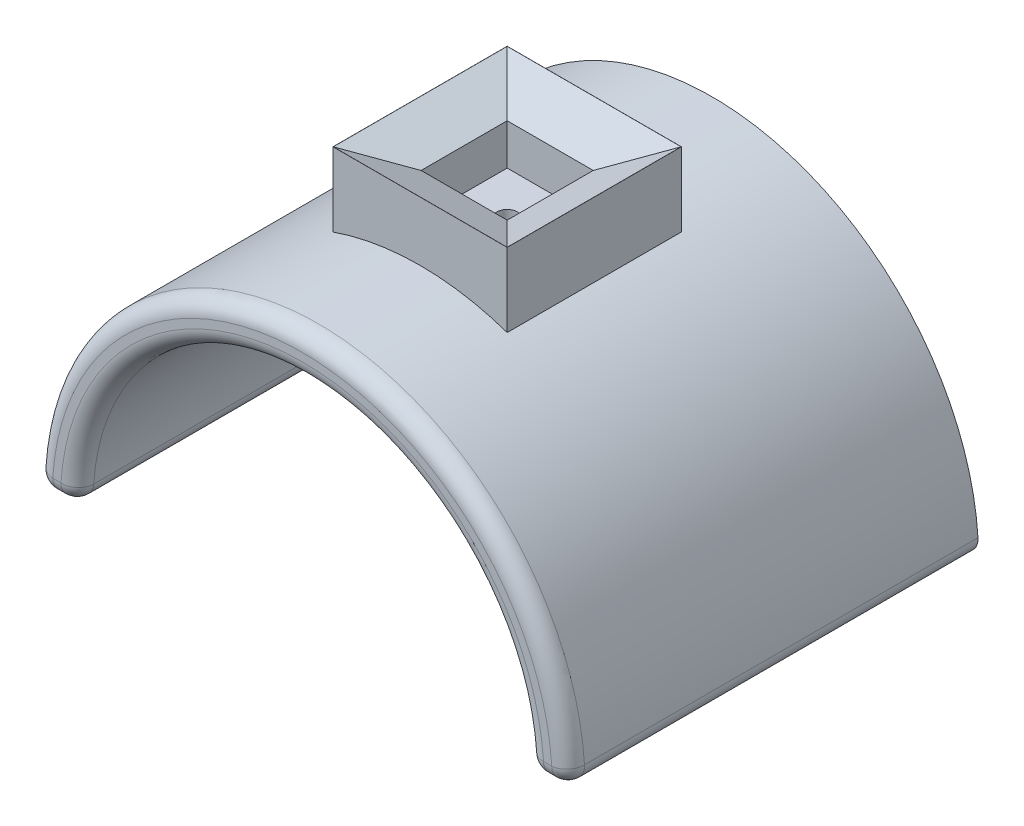
ISO-10303-21;
HEADER;
FILE_DESCRIPTION(('STEP AP214'),'2;1');
FILE_NAME('part.step','',(''),(''),'','','');
FILE_SCHEMA(('AUTOMOTIVE_DESIGN { 1 0 10303 214 1 1 1 1 }'));
ENDSEC;
DATA;
#1=APPLICATION_CONTEXT('core data for automotive mechanical design processes');
#2=APPLICATION_PROTOCOL_DEFINITION('international standard','automotive_design',2000,#1);
#3=PRODUCT_CONTEXT('',#1,'mechanical');
#4=PRODUCT('Part','Part','',(#3));
#5=PRODUCT_RELATED_PRODUCT_CATEGORY('part','',(#4));
#6=PRODUCT_DEFINITION_FORMATION('','',#4);
#7=PRODUCT_DEFINITION_CONTEXT('part definition',#1,'design');
#8=PRODUCT_DEFINITION('design','',#6,#7);
#9=PRODUCT_DEFINITION_SHAPE('','',#8);
#10=(LENGTH_UNIT() NAMED_UNIT(*) SI_UNIT(.MILLI.,.METRE.));
#11=(NAMED_UNIT(*) PLANE_ANGLE_UNIT() SI_UNIT($,.RADIAN.));
#12=(NAMED_UNIT(*) SI_UNIT($,.STERADIAN.) SOLID_ANGLE_UNIT());
#13=UNCERTAINTY_MEASURE_WITH_UNIT(LENGTH_MEASURE(1.E-05),#10,'distance_accuracy_value','');
#14=(GEOMETRIC_REPRESENTATION_CONTEXT(3) GLOBAL_UNCERTAINTY_ASSIGNED_CONTEXT((#13)) GLOBAL_UNIT_ASSIGNED_CONTEXT((#10,
#11,#12)) REPRESENTATION_CONTEXT('',''));
#15=CARTESIAN_POINT('',(0.,0.,0.));
#16=DIRECTION('',(0.,0.,1.));
#17=DIRECTION('',(1.,0.,0.));
#18=AXIS2_PLACEMENT_3D('',#15,#16,#17);
#19=CARTESIAN_POINT('',(0.,0.,50.));
#20=DIRECTION('',(0.,0.,-1.));
#21=DIRECTION('',(-1.,0.,0.));
#22=AXIS2_PLACEMENT_3D('',#19,#20,#21);
#23=CYLINDRICAL_SURFACE('',#22,65.);
#24=DIRECTION('',(0.,0.,-1.));
#25=VECTOR('',#24,1.);
#26=CARTESIAN_POINT('',(-64.8601020707973,4.26229508196721,50.));
#27=LINE('',#26,#25);
#28=CARTESIAN_POINT('',(-64.8601020707972,4.26229508196721,-50.));
#29=VERTEX_POINT('',#28);
#30=CARTESIAN_POINT('',(-64.8601020707973,4.26229508196721,46.));
#31=VERTEX_POINT('',#30);
#32=EDGE_CURVE('E292',#29,#31,#27,.F.);
#33=ORIENTED_EDGE('',*,*,#32,.T.);
#34=CARTESIAN_POINT('',(0.,0.,46.));
#35=DIRECTION('',(0.,0.,-1.));
#36=DIRECTION('',(-1.,0.,0.));
#37=AXIS2_PLACEMENT_3D('',#34,#35,#36);
#38=CIRCLE('',#37,65.);
#39=CARTESIAN_POINT('',(64.8601020707973,4.26229508196721,46.));
#40=VERTEX_POINT('',#39);
#41=EDGE_CURVE('E367',#31,#40,#38,.T.);
#42=ORIENTED_EDGE('',*,*,#41,.T.);
#43=DIRECTION('',(0.,0.,-1.));
#44=VECTOR('',#43,1.);
#45=CARTESIAN_POINT('',(64.8601020707973,4.26229508196721,50.));
#46=LINE('',#45,#44);
#47=CARTESIAN_POINT('',(64.8601020707972,4.26229508196721,-50.));
#48=VERTEX_POINT('',#47);
#49=EDGE_CURVE('E296',#40,#48,#46,.T.);
#50=ORIENTED_EDGE('',*,*,#49,.T.);
#51=CARTESIAN_POINT('',(0.,0.,-50.));
#52=DIRECTION('',(0.,0.,1.));
#53=DIRECTION('',(-1.,0.,0.));
#54=AXIS2_PLACEMENT_3D('',#51,#52,#53);
#55=CIRCLE('',#54,65.);
#56=EDGE_CURVE('E284',#48,#29,#55,.T.);
#57=ORIENTED_EDGE('',*,*,#56,.T.);
#58=EDGE_LOOP('',(#33,#42,#50,#57));
#59=FACE_BOUND('',#58,.T.);
#60=CARTESIAN_POINT('',(0.,0.,21.25));
#61=DIRECTION('',(0.,0.,-1.));
#62=DIRECTION('',(-1.,0.,0.));
#63=AXIS2_PLACEMENT_3D('',#60,#61,#62);
#64=CIRCLE('',#63,65.);
#65=CARTESIAN_POINT('',(-21.25,61.4283118765281,21.25));
#66=VERTEX_POINT('',#65);
#67=CARTESIAN_POINT('',(21.25,61.4283118765281,21.25));
#68=VERTEX_POINT('',#67);
#69=EDGE_CURVE('E234',#66,#68,#64,.T.);
#70=ORIENTED_EDGE('',*,*,#69,.F.);
#71=DIRECTION('',(0.,0.,-1.));
#72=VECTOR('',#71,1.);
#73=CARTESIAN_POINT('',(-21.25,61.4283118765281,21.25));
#74=LINE('',#73,#72);
#75=CARTESIAN_POINT('',(-21.25,61.4283118765281,-21.25));
#76=VERTEX_POINT('',#75);
#77=EDGE_CURVE('E248',#66,#76,#74,.T.);
#78=ORIENTED_EDGE('',*,*,#77,.T.);
#79=CARTESIAN_POINT('',(0.,0.,-21.25));
#80=DIRECTION('',(0.,0.,-1.));
#81=DIRECTION('',(-1.,0.,0.));
#82=AXIS2_PLACEMENT_3D('',#79,#80,#81);
#83=CIRCLE('',#82,65.);
#84=CARTESIAN_POINT('',(21.25,61.4283118765281,-21.25));
#85=VERTEX_POINT('',#84);
#86=EDGE_CURVE('E249',#76,#85,#83,.T.);
#87=ORIENTED_EDGE('',*,*,#86,.T.);
#88=DIRECTION('',(0.,0.,-1.));
#89=VECTOR('',#88,1.);
#90=CARTESIAN_POINT('',(21.25,61.4283118765281,21.25));
#91=LINE('',#90,#89);
#92=EDGE_CURVE('E273',#68,#85,#91,.T.);
#93=ORIENTED_EDGE('',*,*,#92,.F.);
#94=EDGE_LOOP('',(#70,#78,#87,#93));
#95=FACE_BOUND('',#94,.T.);
#96=ADVANCED_FACE('F43',(#59,#95),#23,.T.);
#97=CARTESIAN_POINT('',(0.,0.,50.));
#98=DIRECTION('',(0.,0.,-1.));
#99=DIRECTION('',(-1.,0.,0.));
#100=AXIS2_PLACEMENT_3D('',#97,#98,#99);
#101=CYLINDRICAL_SURFACE('',#100,55.);
#102=CARTESIAN_POINT('',(0.,55.,5.));
#103=CARTESIAN_POINT('',(0.140165542643633,55.0000003250651,5.00000131042897));
#104=CARTESIAN_POINT('',(0.280310836375489,54.999463099121,4.9941038271243));
#105=CARTESIAN_POINT('',(0.559647735606449,54.9973298977333,4.97055721053996));
#106=CARTESIAN_POINT('',(0.698839100152653,54.9957336640807,4.95290521125163));
#107=CARTESIAN_POINT('',(0.975341601463336,54.9915252299401,4.9059547124536));
#108=CARTESIAN_POINT('',(1.11265111440405,54.9889122029881,4.87664673837453));
#109=CARTESIAN_POINT('',(1.3843509275886,54.9827431487663,4.80658520165259));
#110=CARTESIAN_POINT('',(1.51874014035062,54.9791867765037,4.76582745136656));
#111=CARTESIAN_POINT('',(1.78346671336769,54.9712358234423,4.67321010086376));
#112=CARTESIAN_POINT('',(1.9138078149832,54.966842045131,4.62136112361292));
#113=CARTESIAN_POINT('',(2.16970034403316,54.9573361920492,4.50688959149565));
#114=CARTESIAN_POINT('',(2.29524998715764,54.9522238529467,4.44426307005639));
#115=CARTESIAN_POINT('',(2.54055449137373,54.9414292624663,4.30873613318204));
#116=CARTESIAN_POINT('',(2.66031267230901,54.9357473434701,4.23584169969684));
#117=CARTESIAN_POINT('',(2.89331660255279,54.9239686669126,4.08023922103316));
#118=CARTESIAN_POINT('',(3.00655992432694,54.9178717565432,3.99752755252106));
#119=CARTESIAN_POINT('',(3.22594593766439,54.9054220875069,3.82269436145111));
#120=CARTESIAN_POINT('',(3.33207170905746,54.8990687729506,3.73055164601981));
#121=CARTESIAN_POINT('',(3.53622867415894,54.8862965989905,3.53762899624862));
#122=CARTESIAN_POINT('',(3.63425686184818,54.8798777162311,3.436845882425));
#123=CARTESIAN_POINT('',(3.82145430421694,54.8671603808995,3.22741484254297));
#124=CARTESIAN_POINT('',(3.9106264137154,54.8608618900505,3.11876947058893));
#125=CARTESIAN_POINT('',(4.07954925530378,54.8485592768787,2.89430734424768));
#126=CARTESIAN_POINT('',(4.15929649841075,54.8425552640466,2.77848795814984));
#127=CARTESIAN_POINT('',(4.30886839958656,54.8310066516679,2.54036373131747));
#128=CARTESIAN_POINT('',(4.37867921983633,54.8254626972069,2.41805016561051));
#129=CARTESIAN_POINT('',(4.50777115735908,54.814999722907,2.16790662648178));
#130=CARTESIAN_POINT('',(4.56704836702819,54.810080935175,2.0400746276793));
#131=CARTESIAN_POINT('',(4.67459322681395,54.8010136708957,1.77988095614516));
#132=CARTESIAN_POINT('',(4.72286511732212,54.7968648977737,1.64752105071721));
#133=CARTESIAN_POINT('',(4.8080924478695,54.7894519847283,1.37916821584362));
#134=CARTESIAN_POINT('',(4.84504371811375,54.7861881708181,1.24317396774234));
#135=CARTESIAN_POINT('',(4.93824925740078,54.7778952217938,0.832050574861149));
#136=CARTESIAN_POINT('',(4.97727448398394,54.7743280156328,0.552763443679249));
#137=CARTESIAN_POINT('',(5.00789063424749,54.771536706463,-0.00826591696936007));
#138=CARTESIAN_POINT('',(4.99948260198416,54.77231250786,-0.290008092261656));
#139=CARTESIAN_POINT('',(4.93563943706431,54.7781021429205,-0.84724784072274));
#140=CARTESIAN_POINT('',(4.88034497648212,54.7831032992048,-1.12276156508057));
#141=CARTESIAN_POINT('',(4.72450073355428,54.7967622738177,-1.66057076988583));
#142=CARTESIAN_POINT('',(4.6239504357559,54.8054201337953,-1.9228660997412));
#143=CARTESIAN_POINT('',(4.38029660701809,54.8254310669799,-2.42725290454355));
#144=CARTESIAN_POINT('',(4.23713025025616,54.8367881143891,-2.66931386984633));
#145=CARTESIAN_POINT('',(3.91235231311207,54.8609143866888,-3.12602338950642));
#146=CARTESIAN_POINT('',(3.73073980416126,54.8736836456842,-3.34067128157013));
#147=CARTESIAN_POINT('',(3.33343740990056,54.8992519993287,-3.73728049178712));
#148=CARTESIAN_POINT('',(3.11762593205527,54.9120510334746,-3.91912003158649));
#149=CARTESIAN_POINT('',(2.65847495376653,54.9361927330635,-4.24400795692451));
#150=CARTESIAN_POINT('',(2.41513542999329,54.9475353972722,-4.38705630958761));
#151=CARTESIAN_POINT('',(1.90775448571964,54.9674891569605,-4.63029489668827));
#152=CARTESIAN_POINT('',(1.64371030164817,54.9760998870163,-4.73047939827757));
#153=CARTESIAN_POINT('',(1.10245309601858,54.9896156183442,-4.88505941104234));
#154=CARTESIAN_POINT('',(0.8252403999605,54.9945207111618,-4.9394560533832));
#155=CARTESIAN_POINT('',(0.266570370758789,55.0000607478585,-5.00076276880477));
#156=CARTESIAN_POINT('',(-0.0148683678511205,55.0007108110995,-5.00784097999307));
#157=CARTESIAN_POINT('',(-0.574928318900229,54.9977079951205,-4.97475086122375));
#158=CARTESIAN_POINT('',(-0.853549562664414,54.9940551637933,-4.93458305713244));
#159=CARTESIAN_POINT('',(-1.39958353399541,54.9828669212842,-4.80828056015822));
#160=CARTESIAN_POINT('',(-1.66701451462541,54.9753381224876,-4.72222414414945));
#161=CARTESIAN_POINT('',(-2.18364282990389,54.9572432082279,-4.50666733940147));
#162=CARTESIAN_POINT('',(-2.43283982355361,54.9466770359802,-4.37716613844234));
#163=CARTESIAN_POINT('',(-2.906689432048,54.923653027346,-4.07797596211013));
#164=CARTESIAN_POINT('',(-3.13127171037137,54.9111900012644,-3.90817599578766));
#165=CARTESIAN_POINT('',(-3.54880586005287,54.8857888447069,-3.53336710045009));
#166=CARTESIAN_POINT('',(-3.74175707672025,54.8728507044039,-3.32835744285458));
#167=CARTESIAN_POINT('',(-4.09113210873866,54.847912361713,-2.88822101458617));
#168=CARTESIAN_POINT('',(-4.24744593107302,54.8359150538645,-2.65300675433383));
#169=CARTESIAN_POINT('',(-4.51835252825773,54.814259489813,-2.15955777727335));
#170=CARTESIAN_POINT('',(-4.63294578696503,54.8046012064835,-1.9013233274866));
#171=CARTESIAN_POINT('',(-4.81697777138454,54.7887331922585,-1.36960081853375));
#172=CARTESIAN_POINT('',(-4.88648300709819,54.7825183838275,-1.09613587614866));
#173=CARTESIAN_POINT('',(-4.9785621767354,54.7742289376389,-0.541204505878983));
#174=CARTESIAN_POINT('',(-5.00113720319747,54.7721542035002,-0.259738264419823));
#175=CARTESIAN_POINT('',(-4.99936463768319,54.7723126212943,0.161511133205772));
#176=CARTESIAN_POINT('',(-4.99286580188123,54.7729076517531,0.301589450518621));
#177=CARTESIAN_POINT('',(-4.96813781859985,54.7751567165922,0.580684259170787));
#178=CARTESIAN_POINT('',(-4.94991302094352,54.7768103582725,0.719701124920744));
#179=CARTESIAN_POINT('',(-4.90185151455798,54.781132008528,0.995739211465156));
#180=CARTESIAN_POINT('',(-4.87201054055007,54.7838003896915,1.13275968001938));
#181=CARTESIAN_POINT('',(-4.80094912124343,54.7900735556209,1.40374409219709));
#182=CARTESIAN_POINT('',(-4.75973284428426,54.7936779973506,1.53770913601284));
#183=CARTESIAN_POINT('',(-4.66619991802295,54.801722415072,1.8017206899522));
#184=CARTESIAN_POINT('',(-4.61388024777648,54.8061626184154,1.93176612263266));
#185=CARTESIAN_POINT('',(-4.49854367268287,54.8157500190577,2.18693880690784));
#186=CARTESIAN_POINT('',(-4.43553068422733,54.8208969573861,2.31206783852861));
#187=CARTESIAN_POINT('',(-4.29921861592025,54.8317553351426,2.55662342977458));
#188=CARTESIAN_POINT('',(-4.22591594226398,54.8374669715918,2.67604797741944));
#189=CARTESIAN_POINT('',(-4.06958846282596,54.8492897799389,2.90826994580372));
#190=CARTESIAN_POINT('',(-3.98656720235473,54.8554008057836,3.02106976081439));
#191=CARTESIAN_POINT('',(-3.81102600490526,54.8678763065371,3.23972415570104));
#192=CARTESIAN_POINT('',(-3.71847062028294,54.8742416691669,3.34555022888107));
#193=CARTESIAN_POINT('',(-3.52481747167081,54.88702097673,3.54899671921523));
#194=CARTESIAN_POINT('',(-3.42372284342962,54.8934349030489,3.64662012247973));
#195=CARTESIAN_POINT('',(-3.21360853224808,54.9061362810642,3.83307453817414));
#196=CARTESIAN_POINT('',(-3.10458405417529,54.9124236532509,3.92190015267174));
#197=CARTESIAN_POINT('',(-2.87947326804284,54.9246878253787,4.0900320716422));
#198=CARTESIAN_POINT('',(-2.76338958181234,54.930664739115,4.16934187819319));
#199=CARTESIAN_POINT('',(-2.5246397915225,54.9421560375496,4.31810446741465));
#200=CARTESIAN_POINT('',(-2.40195785366081,54.9476692200918,4.38753193531608));
#201=CARTESIAN_POINT('',(-2.15119677022487,54.9580575778076,4.51576986643604));
#202=CARTESIAN_POINT('',(-2.02311962116256,54.9629329862965,4.57458421522836));
#203=CARTESIAN_POINT('',(-1.76254112845458,54.9719057720265,4.68115847278136));
#204=CARTESIAN_POINT('',(-1.63004356647407,54.9760037952197,4.72892756665578));
#205=CARTESIAN_POINT('',(-1.3615133719197,54.9833095305775,4.81311556270563));
#206=CARTESIAN_POINT('',(-1.22548162732645,54.9865174640603,4.8495372866484));
#207=CARTESIAN_POINT('',(-0.909734550366662,54.99276474901,4.91993618708642));
#208=CARTESIAN_POINT('',(-0.729110561967604,54.9954673808124,4.9499318634639));
#209=CARTESIAN_POINT('',(-0.365646229923647,54.999084791411,4.98996288279025));
#210=CARTESIAN_POINT('',(-0.182805893518251,54.9999995760455,4.9999982909199));
#211=CARTESIAN_POINT('',(0.,55.,5.));
#212=B_SPLINE_CURVE_WITH_KNOTS('',3,(#102,#103,#104,#105,#106,#107,#108,#109,#110,#111,#112,
#113,#114,#115,#116,#117,#118,#119,#120,#121,#122,#123,#124,#125,#126,#127,#128,#129,#130,#131,
#132,#133,#134,#135,#136,#137,#138,#139,#140,#141,#142,#143,#144,#145,#146,#147,#148,#149,#150,
#151,#152,#153,#154,#155,#156,#157,#158,#159,#160,#161,#162,#163,#164,#165,#166,#167,#168,#169,
#170,#171,#172,#173,#174,#175,#176,#177,#178,#179,#180,#181,#182,#183,#184,#185,#186,#187,#188,
#189,#190,#191,#192,#193,#194,#195,#196,#197,#198,#199,#200,#201,#202,#203,#204,#205,#206,#207,
#208,#209,#210,#211),.UNSPECIFIED.,.T.,.F.,(4,2,2,2,2,2,2,2,2,2,2,2,2,2,2,2,2,2,2,2,2,2,2,2,2,2,
2,2,2,2,2,2,2,2,2,2,2,2,2,2,2,2,2,2,2,2,2,2,2,2,2,2,2,2,4),(0.,0.420336800695163,
0.840776126260461,1.261557907092,1.68249378553801,2.10302829045597,2.52371790140958,
2.944163430101,3.36476462171143,3.78633262562817,4.20805642901091,4.62964384247929,
5.05138683738607,5.47371153745352,5.89619257974529,6.31851056232702,6.74098391343307,
7.58266972533651,8.42433701091569,9.26348796383424,10.1026484747154,10.9430522793376,
11.7834763840845,12.6269585338811,13.4704413985271,14.3140370399933,15.1576118402535,
15.9981875383088,16.838753880522,17.6778909485801,18.51704370556,19.3585350431878,
20.2000437955665,21.0440474649003,21.8880413455349,22.7307873902389,23.5735138155372,
23.9937957140538,24.4139217960383,24.8342022874976,25.2543289763613,25.6745701176421,
26.094657677894,26.5148923258794,26.9349741485052,27.3566784229889,27.7782285085066,
28.2000356567108,28.6216870890386,29.0443999080305,29.4669576520602,29.8891627276363,
30.3112627288953,30.8594737506971,31.4076829822987),.UNSPECIFIED.);
#213=CARTESIAN_POINT('',(0.,55.,5.));
#214=VERTEX_POINT('',#213);
#215=EDGE_CURVE('E48',#214,#214,#212,.T.);
#216=ORIENTED_EDGE('',*,*,#215,.T.);
#217=EDGE_LOOP('',(#216));
#218=FACE_BOUND('',#217,.T.);
#219=DIRECTION('',(0.,0.,-1.));
#220=VECTOR('',#219,1.);
#221=CARTESIAN_POINT('',(54.8734539594494,3.72881355932203,50.));
#222=LINE('',#221,#220);
#223=CARTESIAN_POINT('',(54.8734539594494,3.72881355932203,-50.));
#224=VERTEX_POINT('',#223);
#225=CARTESIAN_POINT('',(54.8734539594494,3.72881355932203,46.));
#226=VERTEX_POINT('',#225);
#227=EDGE_CURVE('E321',#224,#226,#222,.F.);
#228=ORIENTED_EDGE('',*,*,#227,.T.);
#229=CARTESIAN_POINT('',(0.,0.,46.));
#230=DIRECTION('',(0.,0.,-1.));
#231=DIRECTION('',(-1.,0.,0.));
#232=AXIS2_PLACEMENT_3D('',#229,#230,#231);
#233=CIRCLE('',#232,55.);
#234=CARTESIAN_POINT('',(-54.8734539594494,3.72881355932203,46.));
#235=VERTEX_POINT('',#234);
#236=EDGE_CURVE('E355',#226,#235,#233,.F.);
#237=ORIENTED_EDGE('',*,*,#236,.T.);
#238=DIRECTION('',(0.,0.,-1.));
#239=VECTOR('',#238,1.);
#240=CARTESIAN_POINT('',(-54.8734539594494,3.72881355932203,50.));
#241=LINE('',#240,#239);
#242=CARTESIAN_POINT('',(-54.8734539594494,3.72881355932203,-50.));
#243=VERTEX_POINT('',#242);
#244=EDGE_CURVE('E318',#235,#243,#241,.T.);
#245=ORIENTED_EDGE('',*,*,#244,.T.);
#246=CARTESIAN_POINT('',(0.,0.,-50.));
#247=DIRECTION('',(0.,0.,-1.));
#248=DIRECTION('',(-1.,0.,0.));
#249=AXIS2_PLACEMENT_3D('',#246,#247,#248);
#250=CIRCLE('',#249,55.);
#251=EDGE_CURVE('E276',#243,#224,#250,.T.);
#252=ORIENTED_EDGE('',*,*,#251,.T.);
#253=EDGE_LOOP('',(#228,#237,#245,#252));
#254=FACE_BOUND('',#253,.T.);
#255=ADVANCED_FACE('F451',(#218,#254),#101,.F.);
#256=CARTESIAN_POINT('',(55.,0.,50.));
#257=DIRECTION('',(0.,1.,0.));
#258=DIRECTION('',(0.,0.,1.));
#259=AXIS2_PLACEMENT_3D('',#256,#257,#258);
#260=PLANE('',#259);
#261=DIRECTION('',(0.,0.,-1.));
#262=VECTOR('',#261,1.);
#263=CARTESIAN_POINT('',(60.8687111741328,0.,50.));
#264=LINE('',#263,#262);
#265=CARTESIAN_POINT('',(60.8687111741328,0.,-50.));
#266=VERTEX_POINT('',#265);
#267=CARTESIAN_POINT('',(60.8687111741328,0.,46.));
#268=VERTEX_POINT('',#267);
#269=EDGE_CURVE('E314',#266,#268,#264,.F.);
#270=ORIENTED_EDGE('',*,*,#269,.T.);
#271=DIRECTION('',(1.,0.,0.));
#272=VECTOR('',#271,1.);
#273=CARTESIAN_POINT('',(55.,0.,46.));
#274=LINE('',#273,#272);
#275=CARTESIAN_POINT('',(58.8642506110457,0.,46.));
#276=VERTEX_POINT('',#275);
#277=EDGE_CURVE('E349',#268,#276,#274,.F.);
#278=ORIENTED_EDGE('',*,*,#277,.T.);
#279=DIRECTION('',(0.,0.,-1.));
#280=VECTOR('',#279,1.);
#281=CARTESIAN_POINT('',(58.8642506110457,0.,50.));
#282=LINE('',#281,#280);
#283=CARTESIAN_POINT('',(58.8642506110457,0.,-50.));
#284=VERTEX_POINT('',#283);
#285=EDGE_CURVE('E311',#276,#284,#282,.T.);
#286=ORIENTED_EDGE('',*,*,#285,.T.);
#287=DIRECTION('',(1.,0.,0.));
#288=VECTOR('',#287,1.);
#289=CARTESIAN_POINT('',(55.,0.,-50.));
#290=LINE('',#289,#288);
#291=EDGE_CURVE('E280',#284,#266,#290,.T.);
#292=ORIENTED_EDGE('',*,*,#291,.T.);
#293=EDGE_LOOP('',(#270,#278,#286,#292));
#294=FACE_BOUND('',#293,.T.);
#295=ADVANCED_FACE('F459',(#294),#260,.F.);
#296=CARTESIAN_POINT('',(-65.,0.,50.));
#297=DIRECTION('',(0.,1.,0.));
#298=DIRECTION('',(0.,0.,1.));
#299=AXIS2_PLACEMENT_3D('',#296,#297,#298);
#300=PLANE('',#299);
#301=DIRECTION('',(0.,0.,-1.));
#302=VECTOR('',#301,1.);
#303=CARTESIAN_POINT('',(-58.8642506110457,0.,50.));
#304=LINE('',#303,#302);
#305=CARTESIAN_POINT('',(-58.8642506110457,0.,-50.));
#306=VERTEX_POINT('',#305);
#307=CARTESIAN_POINT('',(-58.8642506110457,0.,46.));
#308=VERTEX_POINT('',#307);
#309=EDGE_CURVE('E328',#306,#308,#304,.F.);
#310=ORIENTED_EDGE('',*,*,#309,.T.);
#311=DIRECTION('',(1.,0.,0.));
#312=VECTOR('',#311,1.);
#313=CARTESIAN_POINT('',(-65.,0.,46.));
#314=LINE('',#313,#312);
#315=CARTESIAN_POINT('',(-60.8687111741328,0.,46.));
#316=VERTEX_POINT('',#315);
#317=EDGE_CURVE('E361',#308,#316,#314,.F.);
#318=ORIENTED_EDGE('',*,*,#317,.T.);
#319=DIRECTION('',(0.,0.,-1.));
#320=VECTOR('',#319,1.);
#321=CARTESIAN_POINT('',(-60.8687111741328,0.,50.));
#322=LINE('',#321,#320);
#323=CARTESIAN_POINT('',(-60.8687111741328,0.,-50.));
#324=VERTEX_POINT('',#323);
#325=EDGE_CURVE('E325',#316,#324,#322,.T.);
#326=ORIENTED_EDGE('',*,*,#325,.T.);
#327=DIRECTION('',(1.,0.,0.));
#328=VECTOR('',#327,1.);
#329=CARTESIAN_POINT('',(-65.,0.,-50.));
#330=LINE('',#329,#328);
#331=EDGE_CURVE('E288',#324,#306,#330,.T.);
#332=ORIENTED_EDGE('',*,*,#331,.T.);
#333=EDGE_LOOP('',(#310,#318,#326,#332));
#334=FACE_BOUND('',#333,.T.);
#335=ADVANCED_FACE('F464',(#334),#300,.F.);
#336=CARTESIAN_POINT('',(0.,0.,50.));
#337=DIRECTION('',(0.,0.,-1.));
#338=DIRECTION('',(-1.,0.,0.));
#339=AXIS2_PLACEMENT_3D('',#336,#337,#338);
#340=PLANE('',#339);
#341=CARTESIAN_POINT('',(0.,0.,50.));
#342=DIRECTION('',(0.,0.,-1.));
#343=DIRECTION('',(-1.,0.,0.));
#344=AXIS2_PLACEMENT_3D('',#341,#342,#343);
#345=CIRCLE('',#344,59.);
#346=CARTESIAN_POINT('',(-58.8642506110457,4.,50.));
#347=VERTEX_POINT('',#346);
#348=CARTESIAN_POINT('',(58.8642506110457,4.,50.));
#349=VERTEX_POINT('',#348);
#350=EDGE_CURVE('E342',#347,#349,#345,.T.);
#351=ORIENTED_EDGE('',*,*,#350,.T.);
#352=DIRECTION('',(1.,0.,0.));
#353=VECTOR('',#352,1.);
#354=CARTESIAN_POINT('',(0.,4.,50.));
#355=LINE('',#354,#353);
#356=CARTESIAN_POINT('',(60.8687111741328,4.,50.));
#357=VERTEX_POINT('',#356);
#358=EDGE_CURVE('E345',#349,#357,#355,.T.);
#359=ORIENTED_EDGE('',*,*,#358,.T.);
#360=CARTESIAN_POINT('',(0.,0.,50.));
#361=DIRECTION('',(0.,0.,-1.));
#362=DIRECTION('',(-1.,0.,0.));
#363=AXIS2_PLACEMENT_3D('',#360,#361,#362);
#364=CIRCLE('',#363,61.);
#365=CARTESIAN_POINT('',(-60.8687111741328,4.,50.));
#366=VERTEX_POINT('',#365);
#367=EDGE_CURVE('E336',#357,#366,#364,.F.);
#368=ORIENTED_EDGE('',*,*,#367,.T.);
#369=DIRECTION('',(1.,0.,0.));
#370=VECTOR('',#369,1.);
#371=CARTESIAN_POINT('',(0.,4.,50.));
#372=LINE('',#371,#370);
#373=EDGE_CURVE('E339',#366,#347,#372,.T.);
#374=ORIENTED_EDGE('',*,*,#373,.T.);
#375=EDGE_LOOP('',(#351,#359,#368,#374));
#376=FACE_BOUND('',#375,.T.);
#377=ADVANCED_FACE('F587',(#376),#340,.F.);
#378=CARTESIAN_POINT('',(0.,0.,-50.));
#379=DIRECTION('',(0.,0.,-1.));
#380=DIRECTION('',(-1.,0.,0.));
#381=AXIS2_PLACEMENT_3D('',#378,#379,#380);
#382=PLANE('',#381);
#383=ORIENTED_EDGE('',*,*,#56,.F.);
#384=CARTESIAN_POINT('',(60.8687111741328,4.,-50.));
#385=DIRECTION('',(0.,0.,-1.));
#386=DIRECTION('',(-1.,0.,0.));
#387=AXIS2_PLACEMENT_3D('',#384,#385,#386);
#388=CIRCLE('',#387,4.);
#389=EDGE_CURVE('E308',#48,#266,#388,.T.);
#390=ORIENTED_EDGE('',*,*,#389,.T.);
#391=ORIENTED_EDGE('',*,*,#291,.F.);
#392=CARTESIAN_POINT('',(58.8642506110457,4.,-50.));
#393=DIRECTION('',(0.,0.,-1.));
#394=DIRECTION('',(-1.,0.,0.));
#395=AXIS2_PLACEMENT_3D('',#392,#393,#394);
#396=CIRCLE('',#395,4.);
#397=EDGE_CURVE('E305',#284,#224,#396,.T.);
#398=ORIENTED_EDGE('',*,*,#397,.T.);
#399=ORIENTED_EDGE('',*,*,#251,.F.);
#400=CARTESIAN_POINT('',(-58.8642506110457,4.,-50.));
#401=DIRECTION('',(0.,0.,-1.));
#402=DIRECTION('',(-1.,0.,0.));
#403=AXIS2_PLACEMENT_3D('',#400,#401,#402);
#404=CIRCLE('',#403,4.);
#405=EDGE_CURVE('E302',#243,#306,#404,.T.);
#406=ORIENTED_EDGE('',*,*,#405,.T.);
#407=ORIENTED_EDGE('',*,*,#331,.F.);
#408=CARTESIAN_POINT('',(-60.8687111741328,4.,-50.));
#409=DIRECTION('',(0.,0.,-1.));
#410=DIRECTION('',(-1.,0.,0.));
#411=AXIS2_PLACEMENT_3D('',#408,#409,#410);
#412=CIRCLE('',#411,4.);
#413=EDGE_CURVE('E299',#324,#29,#412,.T.);
#414=ORIENTED_EDGE('',*,*,#413,.T.);
#415=EDGE_LOOP('',(#383,#390,#391,#398,#399,#406,#407,#414));
#416=FACE_BOUND('',#415,.T.);
#417=ADVANCED_FACE('F585',(#416),#382,.T.);
#418=CARTESIAN_POINT('',(21.25,79.4283118765281,21.25));
#419=DIRECTION('',(-1.,0.,0.));
#420=DIRECTION('',(0.,0.,1.));
#421=AXIS2_PLACEMENT_3D('',#418,#419,#420);
#422=PLANE('',#421);
#423=DIRECTION('',(0.,1.,0.));
#424=VECTOR('',#423,1.);
#425=CARTESIAN_POINT('',(21.25,79.4283118765281,-21.25));
#426=LINE('',#425,#424);
#427=CARTESIAN_POINT('',(21.25,79.4283118765281,-21.25));
#428=VERTEX_POINT('',#427);
#429=EDGE_CURVE('E253',#85,#428,#426,.T.);
#430=ORIENTED_EDGE('',*,*,#429,.T.);
#431=DIRECTION('',(0.,0.,-1.));
#432=VECTOR('',#431,1.);
#433=CARTESIAN_POINT('',(21.25,79.4283118765281,21.25));
#434=LINE('',#433,#432);
#435=CARTESIAN_POINT('',(21.25,79.4283118765281,21.25));
#436=VERTEX_POINT('',#435);
#437=EDGE_CURVE('E269',#436,#428,#434,.T.);
#438=ORIENTED_EDGE('',*,*,#437,.F.);
#439=DIRECTION('',(0.,1.,0.));
#440=VECTOR('',#439,1.);
#441=CARTESIAN_POINT('',(21.25,79.4283118765281,21.25));
#442=LINE('',#441,#440);
#443=EDGE_CURVE('E238',#68,#436,#442,.T.);
#444=ORIENTED_EDGE('',*,*,#443,.F.);
#445=ORIENTED_EDGE('',*,*,#92,.T.);
#446=EDGE_LOOP('',(#430,#438,#444,#445));
#447=FACE_BOUND('',#446,.T.);
#448=ADVANCED_FACE('F582',(#447),#422,.F.);
#449=CARTESIAN_POINT('',(-21.25,79.4283118765281,21.25));
#450=DIRECTION('',(0.,-1.,0.));
#451=DIRECTION('',(1.,0.,0.));
#452=AXIS2_PLACEMENT_3D('',#449,#450,#451);
#453=PLANE('',#452);
#454=DIRECTION('',(-1.,0.,0.));
#455=VECTOR('',#454,1.);
#456=CARTESIAN_POINT('',(-21.25,79.4283118765281,21.2225346025478));
#457=LINE('',#456,#455);
#458=CARTESIAN_POINT('',(21.2225346025477,79.4283118765281,21.2225346025478));
#459=VERTEX_POINT('',#458);
#460=CARTESIAN_POINT('',(-21.2225346025478,79.4283118765281,21.2225346025478));
#461=VERTEX_POINT('',#460);
#462=EDGE_CURVE('E408',#459,#461,#457,.T.);
#463=ORIENTED_EDGE('',*,*,#462,.T.);
#464=DIRECTION('',(0.,0.,-1.));
#465=VECTOR('',#464,1.);
#466=CARTESIAN_POINT('',(-21.2225346025478,79.4283118765281,21.25));
#467=LINE('',#466,#465);
#468=CARTESIAN_POINT('',(-21.2225346025478,79.4283118765281,-21.2225346025478));
#469=VERTEX_POINT('',#468);
#470=EDGE_CURVE('E411',#461,#469,#467,.T.);
#471=ORIENTED_EDGE('',*,*,#470,.T.);
#472=DIRECTION('',(1.,0.,0.));
#473=VECTOR('',#472,1.);
#474=CARTESIAN_POINT('',(-21.25,79.4283118765281,-21.2225346025478));
#475=LINE('',#474,#473);
#476=CARTESIAN_POINT('',(21.2225346025477,79.4283118765281,-21.2225346025478));
#477=VERTEX_POINT('',#476);
#478=EDGE_CURVE('E402',#469,#477,#475,.T.);
#479=ORIENTED_EDGE('',*,*,#478,.T.);
#480=DIRECTION('',(0.,0.,1.));
#481=VECTOR('',#480,1.);
#482=CARTESIAN_POINT('',(21.2225346025477,79.4283118765281,21.25));
#483=LINE('',#482,#481);
#484=EDGE_CURVE('E405',#477,#459,#483,.T.);
#485=ORIENTED_EDGE('',*,*,#484,.T.);
#486=EDGE_LOOP('',(#463,#471,#479,#485));
#487=FACE_BOUND('',#486,.T.);
#488=DIRECTION('',(-1.,0.,0.));
#489=VECTOR('',#488,1.);
#490=CARTESIAN_POINT('',(-21.25,79.4283118765281,-21.25));
#491=LINE('',#490,#489);
#492=CARTESIAN_POINT('',(-21.25,79.4283118765281,-21.25));
#493=VERTEX_POINT('',#492);
#494=EDGE_CURVE('E257',#428,#493,#491,.T.);
#495=ORIENTED_EDGE('',*,*,#494,.T.);
#496=DIRECTION('',(0.,0.,-1.));
#497=VECTOR('',#496,1.);
#498=CARTESIAN_POINT('',(-21.25,79.4283118765281,21.25));
#499=LINE('',#498,#497);
#500=CARTESIAN_POINT('',(-21.25,79.4283118765281,21.25));
#501=VERTEX_POINT('',#500);
#502=EDGE_CURVE('E265',#501,#493,#499,.T.);
#503=ORIENTED_EDGE('',*,*,#502,.F.);
#504=DIRECTION('',(-1.,0.,0.));
#505=VECTOR('',#504,1.);
#506=CARTESIAN_POINT('',(-21.25,79.4283118765281,21.25));
#507=LINE('',#506,#505);
#508=EDGE_CURVE('E242',#436,#501,#507,.T.);
#509=ORIENTED_EDGE('',*,*,#508,.F.);
#510=ORIENTED_EDGE('',*,*,#437,.T.);
#511=EDGE_LOOP('',(#495,#503,#509,#510));
#512=FACE_BOUND('',#511,.T.);
#513=ADVANCED_FACE('F548',(#487,#512),#453,.F.);
#514=CARTESIAN_POINT('',(-21.25,61.4283118765281,21.25));
#515=DIRECTION('',(1.,0.,0.));
#516=DIRECTION('',(0.,0.,-1.));
#517=AXIS2_PLACEMENT_3D('',#514,#515,#516);
#518=PLANE('',#517);
#519=DIRECTION('',(0.,-1.,0.));
#520=VECTOR('',#519,1.);
#521=CARTESIAN_POINT('',(-21.25,61.4283118765281,-21.25));
#522=LINE('',#521,#520);
#523=EDGE_CURVE('E239',#493,#76,#522,.T.);
#524=ORIENTED_EDGE('',*,*,#523,.T.);
#525=ORIENTED_EDGE('',*,*,#77,.F.);
#526=DIRECTION('',(0.,-1.,0.));
#527=VECTOR('',#526,1.);
#528=CARTESIAN_POINT('',(-21.25,61.4283118765281,21.25));
#529=LINE('',#528,#527);
#530=EDGE_CURVE('E245',#501,#66,#529,.T.);
#531=ORIENTED_EDGE('',*,*,#530,.F.);
#532=ORIENTED_EDGE('',*,*,#502,.T.);
#533=EDGE_LOOP('',(#524,#525,#531,#532));
#534=FACE_BOUND('',#533,.T.);
#535=ADVANCED_FACE('F572',(#534),#518,.F.);
#536=CARTESIAN_POINT('',(0.,0.,21.25));
#537=DIRECTION('',(0.,0.,-1.));
#538=DIRECTION('',(-1.,0.,0.));
#539=AXIS2_PLACEMENT_3D('',#536,#537,#538);
#540=PLANE('',#539);
#541=ORIENTED_EDGE('',*,*,#69,.T.);
#542=ORIENTED_EDGE('',*,*,#443,.T.);
#543=ORIENTED_EDGE('',*,*,#508,.T.);
#544=ORIENTED_EDGE('',*,*,#530,.T.);
#545=EDGE_LOOP('',(#541,#542,#543,#544));
#546=FACE_BOUND('',#545,.T.);
#547=ADVANCED_FACE('F569',(#546),#540,.F.);
#548=CARTESIAN_POINT('',(0.,0.,-21.25));
#549=DIRECTION('',(0.,0.,-1.));
#550=DIRECTION('',(-1.,0.,0.));
#551=AXIS2_PLACEMENT_3D('',#548,#549,#550);
#552=PLANE('',#551);
#553=ORIENTED_EDGE('',*,*,#86,.F.);
#554=ORIENTED_EDGE('',*,*,#523,.F.);
#555=ORIENTED_EDGE('',*,*,#494,.F.);
#556=ORIENTED_EDGE('',*,*,#429,.F.);
#557=EDGE_LOOP('',(#553,#554,#555,#556));
#558=FACE_BOUND('',#557,.T.);
#559=ADVANCED_FACE('F473',(#558),#552,.T.);
#560=CARTESIAN_POINT('',(60.8687111741328,4.,50.));
#561=DIRECTION('',(0.,0.,-1.));
#562=DIRECTION('',(-1.,0.,0.));
#563=AXIS2_PLACEMENT_3D('',#560,#561,#562);
#564=CYLINDRICAL_SURFACE('',#563,4.);
#565=ORIENTED_EDGE('',*,*,#49,.F.);
#566=CARTESIAN_POINT('',(60.8687111741328,4.,46.));
#567=DIRECTION('',(0.,0.,-1.));
#568=DIRECTION('',(-1.,0.,0.));
#569=AXIS2_PLACEMENT_3D('',#566,#567,#568);
#570=CIRCLE('',#569,4.);
#571=EDGE_CURVE('E332',#40,#268,#570,.T.);
#572=ORIENTED_EDGE('',*,*,#571,.T.);
#573=ORIENTED_EDGE('',*,*,#269,.F.);
#574=ORIENTED_EDGE('',*,*,#389,.F.);
#575=EDGE_LOOP('',(#565,#572,#573,#574));
#576=FACE_BOUND('',#575,.T.);
#577=ADVANCED_FACE('F469',(#576),#564,.T.);
#578=CARTESIAN_POINT('',(58.8642506110457,4.,50.));
#579=DIRECTION('',(0.,0.,-1.));
#580=DIRECTION('',(-1.,0.,0.));
#581=AXIS2_PLACEMENT_3D('',#578,#579,#580);
#582=CYLINDRICAL_SURFACE('',#581,4.);
#583=ORIENTED_EDGE('',*,*,#285,.F.);
#584=CARTESIAN_POINT('',(58.8642506110457,4.,46.));
#585=DIRECTION('',(0.,0.,-1.));
#586=DIRECTION('',(-1.,0.,0.));
#587=AXIS2_PLACEMENT_3D('',#584,#585,#586);
#588=CIRCLE('',#587,4.);
#589=EDGE_CURVE('E352',#276,#226,#588,.T.);
#590=ORIENTED_EDGE('',*,*,#589,.T.);
#591=ORIENTED_EDGE('',*,*,#227,.F.);
#592=ORIENTED_EDGE('',*,*,#397,.F.);
#593=EDGE_LOOP('',(#583,#590,#591,#592));
#594=FACE_BOUND('',#593,.T.);
#595=ADVANCED_FACE('F472',(#594),#582,.T.);
#596=CARTESIAN_POINT('',(-58.8642506110457,4.,50.));
#597=DIRECTION('',(0.,0.,-1.));
#598=DIRECTION('',(-1.,0.,0.));
#599=AXIS2_PLACEMENT_3D('',#596,#597,#598);
#600=CYLINDRICAL_SURFACE('',#599,4.);
#601=ORIENTED_EDGE('',*,*,#244,.F.);
#602=CARTESIAN_POINT('',(-58.8642506110457,4.,46.));
#603=DIRECTION('',(0.,0.,-1.));
#604=DIRECTION('',(-1.,0.,0.));
#605=AXIS2_PLACEMENT_3D('',#602,#603,#604);
#606=CIRCLE('',#605,4.);
#607=EDGE_CURVE('E358',#235,#308,#606,.T.);
#608=ORIENTED_EDGE('',*,*,#607,.T.);
#609=ORIENTED_EDGE('',*,*,#309,.F.);
#610=ORIENTED_EDGE('',*,*,#405,.F.);
#611=EDGE_LOOP('',(#601,#608,#609,#610));
#612=FACE_BOUND('',#611,.T.);
#613=ADVANCED_FACE('F477',(#612),#600,.T.);
#614=CARTESIAN_POINT('',(-60.8687111741328,4.,50.));
#615=DIRECTION('',(0.,0.,-1.));
#616=DIRECTION('',(-1.,0.,0.));
#617=AXIS2_PLACEMENT_3D('',#614,#615,#616);
#618=CYLINDRICAL_SURFACE('',#617,4.);
#619=ORIENTED_EDGE('',*,*,#325,.F.);
#620=CARTESIAN_POINT('',(-60.8687111741328,4.,46.));
#621=DIRECTION('',(0.,0.,-1.));
#622=DIRECTION('',(-1.,0.,0.));
#623=AXIS2_PLACEMENT_3D('',#620,#621,#622);
#624=CIRCLE('',#623,4.);
#625=EDGE_CURVE('E364',#316,#31,#624,.T.);
#626=ORIENTED_EDGE('',*,*,#625,.T.);
#627=ORIENTED_EDGE('',*,*,#32,.F.);
#628=ORIENTED_EDGE('',*,*,#413,.F.);
#629=EDGE_LOOP('',(#619,#626,#627,#628));
#630=FACE_BOUND('',#629,.T.);
#631=ADVANCED_FACE('F481',(#630),#618,.T.);
#632=CARTESIAN_POINT('',(-58.8642506110457,4.,46.));
#633=DIRECTION('',(0.,0.,-1.));
#634=DIRECTION('',(-1.,0.,0.));
#635=AXIS2_PLACEMENT_3D('',#632,#633,#634);
#636=SPHERICAL_SURFACE('',#635,4.);
#637=CARTESIAN_POINT('',(-58.8642506110457,4.,46.));
#638=DIRECTION('',(-1.,0.,0.));
#639=DIRECTION('',(0.,0.,1.));
#640=AXIS2_PLACEMENT_3D('',#637,#638,#639);
#641=CIRCLE('',#640,4.);
#642=EDGE_CURVE('E392',#308,#347,#641,.T.);
#643=ORIENTED_EDGE('',*,*,#642,.F.);
#644=ORIENTED_EDGE('',*,*,#607,.F.);
#645=CARTESIAN_POINT('',(-58.8642506110457,4.,46.));
#646=DIRECTION('',(0.0677966101694916,0.99769916289908,0.));
#647=DIRECTION('',(-0.997699162899081,0.0677966101694916,0.));
#648=AXIS2_PLACEMENT_3D('',#645,#646,#647);
#649=CIRCLE('',#648,4.);
#650=EDGE_CURVE('E254',#347,#235,#649,.T.);
#651=ORIENTED_EDGE('',*,*,#650,.F.);
#652=EDGE_LOOP('',(#643,#644,#651));
#653=FACE_BOUND('',#652,.T.);
#654=ADVANCED_FACE('F485',(#653),#636,.T.);
#655=CARTESIAN_POINT('',(0.,0.,46.));
#656=DIRECTION('',(0.,0.,-1.));
#657=DIRECTION('',(-1.,0.,0.));
#658=AXIS2_PLACEMENT_3D('',#655,#656,#657);
#659=TOROIDAL_SURFACE('',#658,59.,4.);
#660=ORIENTED_EDGE('',*,*,#650,.T.);
#661=ORIENTED_EDGE('',*,*,#236,.F.);
#662=CARTESIAN_POINT('',(58.8642506110457,4.,46.));
#663=DIRECTION('',(0.0677966101694916,-0.99769916289908,0.));
#664=DIRECTION('',(0.997699162899081,0.0677966101694916,0.));
#665=AXIS2_PLACEMENT_3D('',#662,#663,#664);
#666=CIRCLE('',#665,4.);
#667=EDGE_CURVE('E388',#349,#226,#666,.T.);
#668=ORIENTED_EDGE('',*,*,#667,.F.);
#669=ORIENTED_EDGE('',*,*,#350,.F.);
#670=EDGE_LOOP('',(#660,#661,#668,#669));
#671=FACE_BOUND('',#670,.T.);
#672=ADVANCED_FACE('F510',(#671),#659,.T.);
#673=CARTESIAN_POINT('',(0.,4.,46.));
#674=DIRECTION('',(1.,0.,0.));
#675=DIRECTION('',(0.,0.,-1.));
#676=AXIS2_PLACEMENT_3D('',#673,#674,#675);
#677=CYLINDRICAL_SURFACE('',#676,4.);
#678=ORIENTED_EDGE('',*,*,#642,.T.);
#679=ORIENTED_EDGE('',*,*,#373,.F.);
#680=CARTESIAN_POINT('',(-60.8687111741328,4.,46.));
#681=DIRECTION('',(-1.,0.,0.));
#682=DIRECTION('',(0.,0.,1.));
#683=AXIS2_PLACEMENT_3D('',#680,#681,#682);
#684=CIRCLE('',#683,4.);
#685=EDGE_CURVE('E384',#316,#366,#684,.T.);
#686=ORIENTED_EDGE('',*,*,#685,.F.);
#687=ORIENTED_EDGE('',*,*,#317,.F.);
#688=EDGE_LOOP('',(#678,#679,#686,#687));
#689=FACE_BOUND('',#688,.T.);
#690=ADVANCED_FACE('F506',(#689),#677,.T.);
#691=CARTESIAN_POINT('',(58.8642506110457,4.,46.));
#692=DIRECTION('',(0.,0.,-1.));
#693=DIRECTION('',(-1.,0.,0.));
#694=AXIS2_PLACEMENT_3D('',#691,#692,#693);
#695=SPHERICAL_SURFACE('',#694,4.);
#696=ORIENTED_EDGE('',*,*,#667,.T.);
#697=ORIENTED_EDGE('',*,*,#589,.F.);
#698=CARTESIAN_POINT('',(58.8642506110457,4.,46.));
#699=DIRECTION('',(1.,0.,0.));
#700=DIRECTION('',(0.,0.,-1.));
#701=AXIS2_PLACEMENT_3D('',#698,#699,#700);
#702=CIRCLE('',#701,4.);
#703=EDGE_CURVE('E380',#349,#276,#702,.T.);
#704=ORIENTED_EDGE('',*,*,#703,.F.);
#705=EDGE_LOOP('',(#696,#697,#704));
#706=FACE_BOUND('',#705,.T.);
#707=ADVANCED_FACE('F502',(#706),#695,.T.);
#708=CARTESIAN_POINT('',(-60.8687111741328,4.,46.));
#709=DIRECTION('',(0.,0.,-1.));
#710=DIRECTION('',(-1.,0.,0.));
#711=AXIS2_PLACEMENT_3D('',#708,#709,#710);
#712=SPHERICAL_SURFACE('',#711,4.);
#713=ORIENTED_EDGE('',*,*,#625,.F.);
#714=ORIENTED_EDGE('',*,*,#685,.T.);
#715=CARTESIAN_POINT('',(-60.8687111741328,4.,46.));
#716=DIRECTION('',(0.0655737704918031,0.997847724166112,0.));
#717=DIRECTION('',(-0.997847724166112,0.0655737704918031,0.));
#718=AXIS2_PLACEMENT_3D('',#715,#716,#717);
#719=CIRCLE('',#718,4.);
#720=EDGE_CURVE('E376',#31,#366,#719,.T.);
#721=ORIENTED_EDGE('',*,*,#720,.F.);
#722=EDGE_LOOP('',(#713,#714,#721));
#723=FACE_BOUND('',#722,.T.);
#724=ADVANCED_FACE('F498',(#723),#712,.T.);
#725=CARTESIAN_POINT('',(0.,4.,46.));
#726=DIRECTION('',(1.,0.,0.));
#727=DIRECTION('',(0.,0.,-1.));
#728=AXIS2_PLACEMENT_3D('',#725,#726,#727);
#729=CYLINDRICAL_SURFACE('',#728,4.);
#730=ORIENTED_EDGE('',*,*,#703,.T.);
#731=ORIENTED_EDGE('',*,*,#277,.F.);
#732=CARTESIAN_POINT('',(60.8687111741328,4.,46.));
#733=DIRECTION('',(1.,0.,0.));
#734=DIRECTION('',(0.,0.,-1.));
#735=AXIS2_PLACEMENT_3D('',#732,#733,#734);
#736=CIRCLE('',#735,4.);
#737=EDGE_CURVE('E373',#357,#268,#736,.T.);
#738=ORIENTED_EDGE('',*,*,#737,.F.);
#739=ORIENTED_EDGE('',*,*,#358,.F.);
#740=EDGE_LOOP('',(#730,#731,#738,#739));
#741=FACE_BOUND('',#740,.T.);
#742=ADVANCED_FACE('F494',(#741),#729,.T.);
#743=CARTESIAN_POINT('',(0.,0.,46.));
#744=DIRECTION('',(0.,0.,-1.));
#745=DIRECTION('',(-1.,0.,0.));
#746=AXIS2_PLACEMENT_3D('',#743,#744,#745);
#747=TOROIDAL_SURFACE('',#746,61.,4.);
#748=ORIENTED_EDGE('',*,*,#720,.T.);
#749=ORIENTED_EDGE('',*,*,#367,.F.);
#750=CARTESIAN_POINT('',(60.8687111741328,4.,46.));
#751=DIRECTION('',(0.0655737704918033,-0.997847724166112,0.));
#752=DIRECTION('',(0.997847724166112,0.0655737704918033,0.));
#753=AXIS2_PLACEMENT_3D('',#750,#751,#752);
#754=CIRCLE('',#753,4.);
#755=EDGE_CURVE('E228',#40,#357,#754,.T.);
#756=ORIENTED_EDGE('',*,*,#755,.F.);
#757=ORIENTED_EDGE('',*,*,#41,.F.);
#758=EDGE_LOOP('',(#748,#749,#756,#757));
#759=FACE_BOUND('',#758,.T.);
#760=ADVANCED_FACE('F490',(#759),#747,.T.);
#761=CARTESIAN_POINT('',(60.8687111741328,4.,46.));
#762=DIRECTION('',(0.,0.,-1.));
#763=DIRECTION('',(-1.,0.,0.));
#764=AXIS2_PLACEMENT_3D('',#761,#762,#763);
#765=SPHERICAL_SURFACE('',#764,4.);
#766=ORIENTED_EDGE('',*,*,#737,.T.);
#767=ORIENTED_EDGE('',*,*,#571,.F.);
#768=ORIENTED_EDGE('',*,*,#755,.T.);
#769=EDGE_LOOP('',(#766,#767,#768));
#770=FACE_BOUND('',#769,.T.);
#771=ADVANCED_FACE('F487',(#770),#765,.T.);
#772=CARTESIAN_POINT('',(10.5,64.4283118765281,10.5));
#773=DIRECTION('',(1.,0.,0.));
#774=DIRECTION('',(0.,0.,-1.));
#775=AXIS2_PLACEMENT_3D('',#772,#773,#774);
#776=PLANE('',#775);
#777=DIRECTION('',(0.,1.,0.));
#778=VECTOR('',#777,1.);
#779=CARTESIAN_POINT('',(10.5,64.4283118765281,10.5));
#780=LINE('',#779,#778);
#781=CARTESIAN_POINT('',(10.5,64.4283118765281,10.5));
#782=VERTEX_POINT('',#781);
#783=CARTESIAN_POINT('',(10.5,74.4283118765281,10.5));
#784=VERTEX_POINT('',#783);
#785=EDGE_CURVE('E225',#782,#784,#780,.T.);
#786=ORIENTED_EDGE('',*,*,#785,.T.);
#787=DIRECTION('',(0.,0.,-1.));
#788=VECTOR('',#787,1.);
#789=CARTESIAN_POINT('',(10.5,74.4283118765281,10.5));
#790=LINE('',#789,#788);
#791=CARTESIAN_POINT('',(10.5,74.4283118765281,-10.5));
#792=VERTEX_POINT('',#791);
#793=EDGE_CURVE('E59',#784,#792,#790,.T.);
#794=ORIENTED_EDGE('',*,*,#793,.T.);
#795=DIRECTION('',(0.,1.,0.));
#796=VECTOR('',#795,1.);
#797=CARTESIAN_POINT('',(10.5,64.4283118765281,-10.5));
#798=LINE('',#797,#796);
#799=CARTESIAN_POINT('',(10.5,64.4283118765281,-10.5));
#800=VERTEX_POINT('',#799);
#801=EDGE_CURVE('E186',#800,#792,#798,.T.);
#802=ORIENTED_EDGE('',*,*,#801,.F.);
#803=DIRECTION('',(0.,0.,-1.));
#804=VECTOR('',#803,1.);
#805=CARTESIAN_POINT('',(10.5,64.4283118765281,10.5));
#806=LINE('',#805,#804);
#807=EDGE_CURVE('E190',#782,#800,#806,.T.);
#808=ORIENTED_EDGE('',*,*,#807,.F.);
#809=EDGE_LOOP('',(#786,#794,#802,#808));
#810=FACE_BOUND('',#809,.T.);
#811=ADVANCED_FACE('F188',(#810),#776,.F.);
#812=CARTESIAN_POINT('',(10.5,64.4283118765281,10.5));
#813=DIRECTION('',(0.,0.,1.));
#814=DIRECTION('',(1.,0.,0.));
#815=AXIS2_PLACEMENT_3D('',#812,#813,#814);
#816=PLANE('',#815);
#817=DIRECTION('',(0.,1.,0.));
#818=VECTOR('',#817,1.);
#819=CARTESIAN_POINT('',(-10.5,64.4283118765281,10.5));
#820=LINE('',#819,#818);
#821=CARTESIAN_POINT('',(-10.5,64.4283118765281,10.5));
#822=VERTEX_POINT('',#821);
#823=CARTESIAN_POINT('',(-10.5,74.4283118765281,10.5));
#824=VERTEX_POINT('',#823);
#825=EDGE_CURVE('E229',#822,#824,#820,.T.);
#826=ORIENTED_EDGE('',*,*,#825,.T.);
#827=DIRECTION('',(1.,0.,0.));
#828=VECTOR('',#827,1.);
#829=CARTESIAN_POINT('',(10.5,74.4283118765281,10.5));
#830=LINE('',#829,#828);
#831=EDGE_CURVE('E74',#824,#784,#830,.T.);
#832=ORIENTED_EDGE('',*,*,#831,.T.);
#833=ORIENTED_EDGE('',*,*,#785,.F.);
#834=DIRECTION('',(1.,0.,0.));
#835=VECTOR('',#834,1.);
#836=CARTESIAN_POINT('',(10.5,64.4283118765281,10.5));
#837=LINE('',#836,#835);
#838=EDGE_CURVE('E196',#822,#782,#837,.T.);
#839=ORIENTED_EDGE('',*,*,#838,.F.);
#840=EDGE_LOOP('',(#826,#832,#833,#839));
#841=FACE_BOUND('',#840,.T.);
#842=ADVANCED_FACE('F555',(#841),#816,.F.);
#843=CARTESIAN_POINT('',(-10.5,64.4283118765281,10.5));
#844=DIRECTION('',(-1.,0.,0.));
#845=DIRECTION('',(0.,0.,1.));
#846=AXIS2_PLACEMENT_3D('',#843,#844,#845);
#847=PLANE('',#846);
#848=DIRECTION('',(0.,1.,0.));
#849=VECTOR('',#848,1.);
#850=CARTESIAN_POINT('',(-10.5,64.4283118765281,-10.5));
#851=LINE('',#850,#849);
#852=CARTESIAN_POINT('',(-10.5,64.4283118765281,-10.5));
#853=VERTEX_POINT('',#852);
#854=CARTESIAN_POINT('',(-10.5,74.4283118765281,-10.5));
#855=VERTEX_POINT('',#854);
#856=EDGE_CURVE('E195',#853,#855,#851,.T.);
#857=ORIENTED_EDGE('',*,*,#856,.T.);
#858=DIRECTION('',(0.,0.,1.));
#859=VECTOR('',#858,1.);
#860=CARTESIAN_POINT('',(-10.5,74.4283118765281,10.5));
#861=LINE('',#860,#859);
#862=EDGE_CURVE('E370',#855,#824,#861,.T.);
#863=ORIENTED_EDGE('',*,*,#862,.T.);
#864=ORIENTED_EDGE('',*,*,#825,.F.);
#865=DIRECTION('',(0.,0.,1.));
#866=VECTOR('',#865,1.);
#867=CARTESIAN_POINT('',(-10.5,64.4283118765281,10.5));
#868=LINE('',#867,#866);
#869=EDGE_CURVE('E206',#853,#822,#868,.T.);
#870=ORIENTED_EDGE('',*,*,#869,.F.);
#871=EDGE_LOOP('',(#857,#863,#864,#870));
#872=FACE_BOUND('',#871,.T.);
#873=ADVANCED_FACE('F554',(#872),#847,.F.);
#874=CARTESIAN_POINT('',(10.5,64.4283118765281,-10.5));
#875=DIRECTION('',(0.,0.,-1.));
#876=DIRECTION('',(-1.,0.,0.));
#877=AXIS2_PLACEMENT_3D('',#874,#875,#876);
#878=PLANE('',#877);
#879=ORIENTED_EDGE('',*,*,#801,.T.);
#880=DIRECTION('',(-1.,0.,0.));
#881=VECTOR('',#880,1.);
#882=CARTESIAN_POINT('',(10.5,74.4283118765281,-10.5));
#883=LINE('',#882,#881);
#884=EDGE_CURVE('E11',#792,#855,#883,.T.);
#885=ORIENTED_EDGE('',*,*,#884,.T.);
#886=ORIENTED_EDGE('',*,*,#856,.F.);
#887=DIRECTION('',(-1.,0.,0.));
#888=VECTOR('',#887,1.);
#889=CARTESIAN_POINT('',(10.5,64.4283118765281,-10.5));
#890=LINE('',#889,#888);
#891=EDGE_CURVE('E199',#800,#853,#890,.T.);
#892=ORIENTED_EDGE('',*,*,#891,.F.);
#893=EDGE_LOOP('',(#879,#885,#886,#892));
#894=FACE_BOUND('',#893,.T.);
#895=ADVANCED_FACE('F200',(#894),#878,.F.);
#896=CARTESIAN_POINT('',(0.,64.4283118765281,0.));
#897=DIRECTION('',(0.,1.,0.));
#898=DIRECTION('',(0.,0.,1.));
#899=AXIS2_PLACEMENT_3D('',#896,#897,#898);
#900=PLANE('',#899);
#901=CARTESIAN_POINT('',(0.,64.4283118765281,0.));
#902=DIRECTION('',(0.,1.,0.));
#903=DIRECTION('',(0.,0.,1.));
#904=AXIS2_PLACEMENT_3D('',#901,#902,#903);
#905=CIRCLE('',#904,2.5);
#906=CARTESIAN_POINT('',(0.,64.4283118765281,2.5));
#907=VERTEX_POINT('',#906);
#908=EDGE_CURVE('E218',#907,#907,#905,.T.);
#909=ORIENTED_EDGE('',*,*,#908,.F.);
#910=EDGE_LOOP('',(#909));
#911=FACE_BOUND('',#910,.T.);
#912=ORIENTED_EDGE('',*,*,#807,.T.);
#913=ORIENTED_EDGE('',*,*,#891,.T.);
#914=ORIENTED_EDGE('',*,*,#869,.T.);
#915=ORIENTED_EDGE('',*,*,#838,.T.);
#916=EDGE_LOOP('',(#912,#913,#914,#915));
#917=FACE_BOUND('',#916,.T.);
#918=ADVANCED_FACE('F208',(#911,#917),#900,.T.);
#919=CARTESIAN_POINT('',(10.5,74.4283118765281,10.5));
#920=DIRECTION('',(0.422618261740701,-0.906307787036649,0.));
#921=DIRECTION('',(0.,0.,-1.));
#922=AXIS2_PLACEMENT_3D('',#919,#920,#921);
#923=PLANE('',#922);
#924=DIRECTION('',(0.671542934237819,0.313145613014975,0.671542934237816));
#925=VECTOR('',#924,1.);
#926=CARTESIAN_POINT('',(10.5,74.4283118765281,10.5));
#927=LINE('',#926,#925);
#928=EDGE_CURVE('E215',#459,#784,#927,.F.);
#929=ORIENTED_EDGE('',*,*,#928,.F.);
#930=ORIENTED_EDGE('',*,*,#484,.F.);
#931=DIRECTION('',(0.671542934237819,0.313145613014974,-0.671542934237817));
#932=VECTOR('',#931,1.);
#933=CARTESIAN_POINT('',(1.02963183698046,70.0122066765648,-1.02963183698055));
#934=LINE('',#933,#932);
#935=EDGE_CURVE('E211',#792,#477,#934,.T.);
#936=ORIENTED_EDGE('',*,*,#935,.F.);
#937=ORIENTED_EDGE('',*,*,#793,.F.);
#938=EDGE_LOOP('',(#929,#930,#936,#937));
#939=FACE_BOUND('',#938,.T.);
#940=ADVANCED_FACE('F46',(#939),#923,.F.);
#941=CARTESIAN_POINT('',(10.5,74.4283118765281,-10.5));
#942=DIRECTION('',(0.,-0.906307787036649,-0.422618261740702));
#943=DIRECTION('',(-1.,0.,0.));
#944=AXIS2_PLACEMENT_3D('',#941,#942,#943);
#945=PLANE('',#944);
#946=ORIENTED_EDGE('',*,*,#935,.T.);
#947=ORIENTED_EDGE('',*,*,#478,.F.);
#948=DIRECTION('',(0.671542934237819,-0.313145613014974,0.671542934237817));
#949=VECTOR('',#948,1.);
#950=CARTESIAN_POINT('',(-1.02963183698052,70.0122066765648,-1.02963183698053));
#951=LINE('',#950,#949);
#952=EDGE_CURVE('E422',#855,#469,#951,.F.);
#953=ORIENTED_EDGE('',*,*,#952,.F.);
#954=ORIENTED_EDGE('',*,*,#884,.F.);
#955=EDGE_LOOP('',(#946,#947,#953,#954));
#956=FACE_BOUND('',#955,.T.);
#957=ADVANCED_FACE('F531',(#956),#945,.F.);
#958=CARTESIAN_POINT('',(10.5,74.4283118765281,10.5));
#959=DIRECTION('',(0.,-0.906307787036649,0.422618261740702));
#960=DIRECTION('',(1.,0.,0.));
#961=AXIS2_PLACEMENT_3D('',#958,#959,#960);
#962=PLANE('',#961);
#963=ORIENTED_EDGE('',*,*,#928,.T.);
#964=ORIENTED_EDGE('',*,*,#831,.F.);
#965=DIRECTION('',(-0.671542934237818,0.313145613014974,0.671542934237817));
#966=VECTOR('',#965,1.);
#967=CARTESIAN_POINT('',(-10.5,74.4283118765281,10.5));
#968=LINE('',#967,#966);
#969=EDGE_CURVE('E419',#461,#824,#968,.F.);
#970=ORIENTED_EDGE('',*,*,#969,.F.);
#971=ORIENTED_EDGE('',*,*,#462,.F.);
#972=EDGE_LOOP('',(#963,#964,#970,#971));
#973=FACE_BOUND('',#972,.T.);
#974=ADVANCED_FACE('F525',(#973),#962,.F.);
#975=CARTESIAN_POINT('',(-10.5,74.4283118765281,10.5));
#976=DIRECTION('',(-0.422618261740701,-0.906307787036649,0.));
#977=DIRECTION('',(0.,0.,1.));
#978=AXIS2_PLACEMENT_3D('',#975,#976,#977);
#979=PLANE('',#978);
#980=ORIENTED_EDGE('',*,*,#952,.T.);
#981=ORIENTED_EDGE('',*,*,#470,.F.);
#982=ORIENTED_EDGE('',*,*,#969,.T.);
#983=ORIENTED_EDGE('',*,*,#862,.F.);
#984=EDGE_LOOP('',(#980,#981,#982,#983));
#985=FACE_BOUND('',#984,.T.);
#986=ADVANCED_FACE('F519',(#985),#979,.F.);
#987=CARTESIAN_POINT('',(0.,0.,0.));
#988=DIRECTION('',(0.,1.,0.));
#989=DIRECTION('',(0.,0.,1.));
#990=AXIS2_PLACEMENT_3D('',#987,#988,#989);
#991=CYLINDRICAL_SURFACE('',#990,2.5);
#992=CARTESIAN_POINT('',(0.,59.4283118765281,0.));
#993=DIRECTION('',(0.,1.,0.));
#994=DIRECTION('',(0.,0.,1.));
#995=AXIS2_PLACEMENT_3D('',#992,#993,#994);
#996=CIRCLE('',#995,2.5);
#997=CARTESIAN_POINT('',(0.,59.4283118765281,2.5));
#998=VERTEX_POINT('',#997);
#999=EDGE_CURVE('E427',#998,#998,#996,.F.);
#1000=ORIENTED_EDGE('',*,*,#999,.T.);
#1001=EDGE_LOOP('',(#1000));
#1002=FACE_BOUND('',#1001,.T.);
#1003=ORIENTED_EDGE('',*,*,#908,.T.);
#1004=EDGE_LOOP('',(#1003));
#1005=FACE_BOUND('',#1004,.T.);
#1006=ADVANCED_FACE('F449',(#1002,#1005),#991,.F.);
#1007=CARTESIAN_POINT('',(0.,0.,0.));
#1008=DIRECTION('',(0.,1.,0.));
#1009=DIRECTION('',(0.,0.,1.));
#1010=AXIS2_PLACEMENT_3D('',#1007,#1008,#1009);
#1011=CYLINDRICAL_SURFACE('',#1010,5.);
#1012=CARTESIAN_POINT('',(0.,59.4283118765281,0.));
#1013=DIRECTION('',(0.,1.,0.));
#1014=DIRECTION('',(0.,0.,1.));
#1015=AXIS2_PLACEMENT_3D('',#1012,#1013,#1014);
#1016=CIRCLE('',#1015,5.);
#1017=CARTESIAN_POINT('',(0.,59.4283118765281,5.));
#1018=VERTEX_POINT('',#1017);
#1019=EDGE_CURVE('E430',#1018,#1018,#1016,.T.);
#1020=ORIENTED_EDGE('',*,*,#1019,.T.);
#1021=EDGE_LOOP('',(#1020));
#1022=FACE_BOUND('',#1021,.T.);
#1023=ORIENTED_EDGE('',*,*,#215,.F.);
#1024=EDGE_LOOP('',(#1023));
#1025=FACE_BOUND('',#1024,.T.);
#1026=ADVANCED_FACE('F439',(#1022,#1025),#1011,.F.);
#1027=CARTESIAN_POINT('',(0.,59.4283118765281,0.));
#1028=DIRECTION('',(0.,1.,0.));
#1029=DIRECTION('',(0.,0.,1.));
#1030=AXIS2_PLACEMENT_3D('',#1027,#1028,#1029);
#1031=PLANE('',#1030);
#1032=ORIENTED_EDGE('',*,*,#1019,.F.);
#1033=EDGE_LOOP('',(#1032));
#1034=FACE_BOUND('',#1033,.T.);
#1035=ORIENTED_EDGE('',*,*,#999,.F.);
#1036=EDGE_LOOP('',(#1035));
#1037=FACE_BOUND('',#1036,.T.);
#1038=ADVANCED_FACE('F442',(#1034,#1037),#1031,.F.);
#1039=CLOSED_SHELL('',(#96,#255,#295,#335,#377,#417,#448,#513,#535,#547,#559,#577,#595,#613,
#631,#654,#672,#690,#707,#724,#742,#760,#771,#811,#842,#873,#895,#918,#940,#957,#974,#986,#1006,
#1026,#1038));
#1040=MANIFOLD_SOLID_BREP('B2',#1039);
#1041=ADVANCED_BREP_SHAPE_REPRESENTATION('',(#18,#1040),#14);
#1042=SHAPE_DEFINITION_REPRESENTATION(#9,#1041);
ENDSEC;
END-ISO-10303-21;
